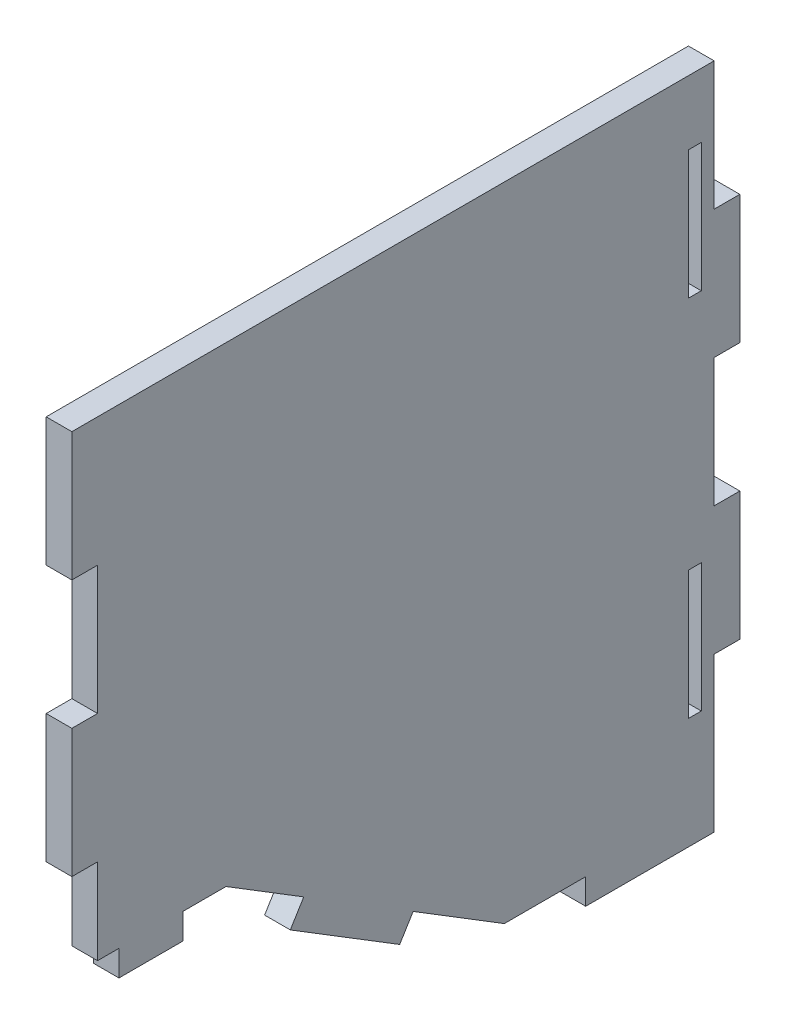
ISO-10303-21;
HEADER;
FILE_DESCRIPTION(('STEP AP214'),'2;1');
FILE_NAME('part.step','',(''),(''),'','','');
FILE_SCHEMA(('AUTOMOTIVE_DESIGN { 1 0 10303 214 1 1 1 1 }'));
ENDSEC;
DATA;
#1=APPLICATION_CONTEXT('core data for automotive mechanical design processes');
#2=APPLICATION_PROTOCOL_DEFINITION('international standard','automotive_design',2000,#1);
#3=PRODUCT_CONTEXT('',#1,'mechanical');
#4=PRODUCT('Part','Part','',(#3));
#5=PRODUCT_RELATED_PRODUCT_CATEGORY('part','',(#4));
#6=PRODUCT_DEFINITION_FORMATION('','',#4);
#7=PRODUCT_DEFINITION_CONTEXT('part definition',#1,'design');
#8=PRODUCT_DEFINITION('design','',#6,#7);
#9=PRODUCT_DEFINITION_SHAPE('','',#8);
#10=(LENGTH_UNIT() NAMED_UNIT(*) SI_UNIT(.MILLI.,.METRE.));
#11=(NAMED_UNIT(*) PLANE_ANGLE_UNIT() SI_UNIT($,.RADIAN.));
#12=(NAMED_UNIT(*) SI_UNIT($,.STERADIAN.) SOLID_ANGLE_UNIT());
#13=UNCERTAINTY_MEASURE_WITH_UNIT(LENGTH_MEASURE(1.E-05),#10,'distance_accuracy_value','');
#14=(GEOMETRIC_REPRESENTATION_CONTEXT(3) GLOBAL_UNCERTAINTY_ASSIGNED_CONTEXT((#13)) GLOBAL_UNIT_ASSIGNED_CONTEXT((#10,
#11,#12)) REPRESENTATION_CONTEXT('',''));
#15=CARTESIAN_POINT('',(0.,0.,0.));
#16=DIRECTION('',(0.,0.,1.));
#17=DIRECTION('',(1.,0.,0.));
#18=AXIS2_PLACEMENT_3D('',#15,#16,#17);
#19=CARTESIAN_POINT('',(-50.001,40.,75.));
#20=DIRECTION('',(0.,1.,0.));
#21=DIRECTION('',(0.,0.,1.));
#22=AXIS2_PLACEMENT_3D('',#19,#20,#21);
#23=PLANE('',#22);
#24=DIRECTION('',(-1.,0.,0.));
#25=VECTOR('',#24,1.);
#26=CARTESIAN_POINT('',(51.,40.,70.));
#27=LINE('',#26,#25);
#28=CARTESIAN_POINT('',(51.,40.,70.));
#29=VERTEX_POINT('',#28);
#30=CARTESIAN_POINT('',(45.,40.,70.));
#31=VERTEX_POINT('',#30);
#32=EDGE_CURVE('E651',#29,#31,#27,.T.);
#33=ORIENTED_EDGE('',*,*,#32,.F.);
#34=DIRECTION('',(0.,0.,-1.));
#35=VECTOR('',#34,1.);
#36=CARTESIAN_POINT('',(51.,40.,45.));
#37=LINE('',#36,#35);
#38=CARTESIAN_POINT('',(51.,40.,75.));
#39=VERTEX_POINT('',#38);
#40=EDGE_CURVE('E306',#39,#29,#37,.T.);
#41=ORIENTED_EDGE('',*,*,#40,.F.);
#42=DIRECTION('',(1.,0.,0.));
#43=VECTOR('',#42,1.);
#44=CARTESIAN_POINT('',(-50.001,40.,75.));
#45=LINE('',#44,#43);
#46=CARTESIAN_POINT('',(45.,40.,75.));
#47=VERTEX_POINT('',#46);
#48=EDGE_CURVE('E11',#47,#39,#45,.T.);
#49=ORIENTED_EDGE('',*,*,#48,.F.);
#50=DIRECTION('',(0.,0.,-1.));
#51=VECTOR('',#50,1.);
#52=CARTESIAN_POINT('',(45.,40.,75.));
#53=LINE('',#52,#51);
#54=EDGE_CURVE('E465',#47,#31,#53,.T.);
#55=ORIENTED_EDGE('',*,*,#54,.T.);
#56=EDGE_LOOP('',(#33,#41,#49,#55));
#57=FACE_BOUND('',#56,.T.);
#58=ADVANCED_FACE('F37',(#57),#23,.F.);
#59=DIRECTION('',(1.,0.,0.));
#60=VECTOR('',#59,1.);
#61=CARTESIAN_POINT('',(51.,40.,55.));
#62=LINE('',#61,#60);
#63=CARTESIAN_POINT('',(45.,40.,55.));
#64=VERTEX_POINT('',#63);
#65=CARTESIAN_POINT('',(51.,40.,55.));
#66=VERTEX_POINT('',#65);
#67=EDGE_CURVE('E300',#64,#66,#62,.T.);
#68=ORIENTED_EDGE('',*,*,#67,.F.);
#69=CARTESIAN_POINT('',(45.,40.,45.));
#70=VERTEX_POINT('',#69);
#71=EDGE_CURVE('E463',#64,#70,#53,.T.);
#72=ORIENTED_EDGE('',*,*,#71,.T.);
#73=DIRECTION('',(1.,0.,0.));
#74=VECTOR('',#73,1.);
#75=CARTESIAN_POINT('',(-50.001,40.,45.));
#76=LINE('',#75,#74);
#77=CARTESIAN_POINT('',(51.,40.,45.));
#78=VERTEX_POINT('',#77);
#79=EDGE_CURVE('E46',#70,#78,#76,.T.);
#80=ORIENTED_EDGE('',*,*,#79,.T.);
#81=EDGE_CURVE('E534',#66,#78,#37,.T.);
#82=ORIENTED_EDGE('',*,*,#81,.F.);
#83=EDGE_LOOP('',(#68,#72,#80,#82));
#84=FACE_BOUND('',#83,.T.);
#85=ADVANCED_FACE('F662',(#84),#23,.F.);
#86=CARTESIAN_POINT('',(-50.001,40.,45.));
#87=DIRECTION('',(0.,0.851658316704544,-0.524097425664335));
#88=DIRECTION('',(0.,0.524097425664335,0.851658316704544));
#89=AXIS2_PLACEMENT_3D('',#86,#87,#88);
#90=PLANE('',#89);
#91=DIRECTION('',(1.,0.,0.));
#92=VECTOR('',#91,1.);
#93=CARTESIAN_POINT('',(45.,13.1024356416084,1.29145791761358));
#94=LINE('',#93,#92);
#95=CARTESIAN_POINT('',(45.,13.1024356416084,1.29145791761358));
#96=VERTEX_POINT('',#95);
#97=CARTESIAN_POINT('',(51.,13.1024356416084,1.29145791761359));
#98=VERTEX_POINT('',#97);
#99=EDGE_CURVE('E307',#96,#98,#94,.T.);
#100=ORIENTED_EDGE('',*,*,#99,.F.);
#101=DIRECTION('',(0.,-0.524097425664335,-0.851658316704544));
#102=VECTOR('',#101,1.);
#103=CARTESIAN_POINT('',(45.,40.,45.));
#104=LINE('',#103,#102);
#105=CARTESIAN_POINT('',(45.,0.,-20.));
#106=VERTEX_POINT('',#105);
#107=EDGE_CURVE('E464',#96,#106,#104,.T.);
#108=ORIENTED_EDGE('',*,*,#107,.T.);
#109=DIRECTION('',(1.,0.,0.));
#110=VECTOR('',#109,1.);
#111=CARTESIAN_POINT('',(-50.001,0.,-20.));
#112=LINE('',#111,#110);
#113=CARTESIAN_POINT('',(51.,0.,-20.));
#114=VERTEX_POINT('',#113);
#115=EDGE_CURVE('E41',#106,#114,#112,.T.);
#116=ORIENTED_EDGE('',*,*,#115,.T.);
#117=DIRECTION('',(0.,-0.524097425664335,-0.851658316704544));
#118=VECTOR('',#117,1.);
#119=CARTESIAN_POINT('',(51.,0.,-20.));
#120=LINE('',#119,#118);
#121=EDGE_CURVE('E536',#98,#114,#120,.T.);
#122=ORIENTED_EDGE('',*,*,#121,.F.);
#123=EDGE_LOOP('',(#100,#108,#116,#122));
#124=FACE_BOUND('',#123,.T.);
#125=ADVANCED_FACE('F561',(#124),#90,.F.);
#126=DIRECTION('',(-1.,0.,0.));
#127=VECTOR('',#126,1.);
#128=CARTESIAN_POINT('',(45.,28.8253584115384,26.8412074187499));
#129=LINE('',#128,#127);
#130=CARTESIAN_POINT('',(51.,28.8253584115384,26.8412074187499));
#131=VERTEX_POINT('',#130);
#132=CARTESIAN_POINT('',(45.,28.8253584115384,26.8412074187499));
#133=VERTEX_POINT('',#132);
#134=EDGE_CURVE('E309',#131,#133,#129,.T.);
#135=ORIENTED_EDGE('',*,*,#134,.F.);
#136=EDGE_CURVE('E537',#78,#131,#120,.T.);
#137=ORIENTED_EDGE('',*,*,#136,.F.);
#138=ORIENTED_EDGE('',*,*,#79,.F.);
#139=EDGE_CURVE('E460',#70,#133,#104,.T.);
#140=ORIENTED_EDGE('',*,*,#139,.T.);
#141=EDGE_LOOP('',(#135,#137,#138,#140));
#142=FACE_BOUND('',#141,.T.);
#143=ADVANCED_FACE('F668',(#142),#90,.F.);
#144=CARTESIAN_POINT('',(-50.,150.,-75.));
#145=DIRECTION('',(0.,0.,1.));
#146=DIRECTION('',(1.,0.,0.));
#147=AXIS2_PLACEMENT_3D('',#144,#145,#146);
#148=PLANE('',#147);
#149=DIRECTION('',(0.,1.,0.));
#150=VECTOR('',#149,1.);
#151=CARTESIAN_POINT('',(45.,0.,-75.));
#152=LINE('',#151,#150);
#153=CARTESIAN_POINT('',(45.,30.,-75.));
#154=VERTEX_POINT('',#153);
#155=CARTESIAN_POINT('',(45.,60.,-75.));
#156=VERTEX_POINT('',#155);
#157=EDGE_CURVE('E459',#154,#156,#152,.T.);
#158=ORIENTED_EDGE('',*,*,#157,.T.);
#159=DIRECTION('',(1.,0.,0.));
#160=VECTOR('',#159,1.);
#161=CARTESIAN_POINT('',(45.,60.,-75.));
#162=LINE('',#161,#160);
#163=CARTESIAN_POINT('',(51.,60.,-75.));
#164=VERTEX_POINT('',#163);
#165=EDGE_CURVE('E373',#156,#164,#162,.T.);
#166=ORIENTED_EDGE('',*,*,#165,.T.);
#167=DIRECTION('',(0.,1.,0.));
#168=VECTOR('',#167,1.);
#169=CARTESIAN_POINT('',(51.,150.,-75.));
#170=LINE('',#169,#168);
#171=CARTESIAN_POINT('',(51.,30.,-75.));
#172=VERTEX_POINT('',#171);
#173=EDGE_CURVE('E545',#172,#164,#170,.T.);
#174=ORIENTED_EDGE('',*,*,#173,.F.);
#175=DIRECTION('',(1.,0.,0.));
#176=VECTOR('',#175,1.);
#177=CARTESIAN_POINT('',(45.,30.,-75.));
#178=LINE('',#177,#176);
#179=EDGE_CURVE('E388',#154,#172,#178,.T.);
#180=ORIENTED_EDGE('',*,*,#179,.F.);
#181=EDGE_LOOP('',(#158,#166,#174,#180));
#182=FACE_BOUND('',#181,.T.);
#183=ADVANCED_FACE('F587',(#182),#148,.F.);
#184=CARTESIAN_POINT('',(-50.,150.,75.));
#185=DIRECTION('',(0.,0.,-1.));
#186=DIRECTION('',(-1.,0.,0.));
#187=AXIS2_PLACEMENT_3D('',#184,#185,#186);
#188=PLANE('',#187);
#189=DIRECTION('',(1.,0.,0.));
#190=VECTOR('',#189,1.);
#191=CARTESIAN_POINT('',(45.,60.,75.));
#192=LINE('',#191,#190);
#193=CARTESIAN_POINT('',(45.,60.,75.));
#194=VERTEX_POINT('',#193);
#195=CARTESIAN_POINT('',(51.,60.,75.));
#196=VERTEX_POINT('',#195);
#197=EDGE_CURVE('E409',#194,#196,#192,.T.);
#198=ORIENTED_EDGE('',*,*,#197,.F.);
#199=DIRECTION('',(0.,-1.,0.));
#200=VECTOR('',#199,1.);
#201=CARTESIAN_POINT('',(45.,150.,75.));
#202=LINE('',#201,#200);
#203=EDGE_CURVE('E468',#194,#47,#202,.T.);
#204=ORIENTED_EDGE('',*,*,#203,.T.);
#205=ORIENTED_EDGE('',*,*,#48,.T.);
#206=DIRECTION('',(0.,-1.,0.));
#207=VECTOR('',#206,1.);
#208=CARTESIAN_POINT('',(51.,40.,75.));
#209=LINE('',#208,#207);
#210=EDGE_CURVE('E530',#196,#39,#209,.T.);
#211=ORIENTED_EDGE('',*,*,#210,.F.);
#212=EDGE_LOOP('',(#198,#204,#205,#211));
#213=FACE_BOUND('',#212,.T.);
#214=ADVANCED_FACE('F647',(#213),#188,.F.);
#215=DIRECTION('',(-1.,0.,0.));
#216=VECTOR('',#215,1.);
#217=CARTESIAN_POINT('',(45.,90.,75.));
#218=LINE('',#217,#216);
#219=CARTESIAN_POINT('',(51.,90.,75.));
#220=VERTEX_POINT('',#219);
#221=CARTESIAN_POINT('',(45.,90.,75.));
#222=VERTEX_POINT('',#221);
#223=EDGE_CURVE('E417',#220,#222,#218,.T.);
#224=ORIENTED_EDGE('',*,*,#223,.F.);
#225=CARTESIAN_POINT('',(51.,120.,75.));
#226=VERTEX_POINT('',#225);
#227=EDGE_CURVE('E531',#226,#220,#209,.T.);
#228=ORIENTED_EDGE('',*,*,#227,.F.);
#229=DIRECTION('',(1.,0.,0.));
#230=VECTOR('',#229,1.);
#231=CARTESIAN_POINT('',(45.,120.,75.));
#232=LINE('',#231,#230);
#233=CARTESIAN_POINT('',(45.,120.,75.));
#234=VERTEX_POINT('',#233);
#235=EDGE_CURVE('E435',#234,#226,#232,.T.);
#236=ORIENTED_EDGE('',*,*,#235,.F.);
#237=EDGE_CURVE('E469',#234,#222,#202,.T.);
#238=ORIENTED_EDGE('',*,*,#237,.T.);
#239=EDGE_LOOP('',(#224,#228,#236,#238));
#240=FACE_BOUND('',#239,.T.);
#241=ADVANCED_FACE('F632',(#240),#188,.F.);
#242=CARTESIAN_POINT('',(51.,90.,-75.));
#243=VERTEX_POINT('',#242);
#244=CARTESIAN_POINT('',(51.,120.,-75.));
#245=VERTEX_POINT('',#244);
#246=EDGE_CURVE('E543',#243,#245,#170,.T.);
#247=ORIENTED_EDGE('',*,*,#246,.F.);
#248=DIRECTION('',(1.,0.,0.));
#249=VECTOR('',#248,1.);
#250=CARTESIAN_POINT('',(45.,90.,-75.));
#251=LINE('',#250,#249);
#252=CARTESIAN_POINT('',(45.,90.,-75.));
#253=VERTEX_POINT('',#252);
#254=EDGE_CURVE('E364',#253,#243,#251,.T.);
#255=ORIENTED_EDGE('',*,*,#254,.F.);
#256=CARTESIAN_POINT('',(45.,120.,-75.));
#257=VERTEX_POINT('',#256);
#258=EDGE_CURVE('E457',#253,#257,#152,.T.);
#259=ORIENTED_EDGE('',*,*,#258,.T.);
#260=DIRECTION('',(1.,0.,0.));
#261=VECTOR('',#260,1.);
#262=CARTESIAN_POINT('',(45.,120.,-75.));
#263=LINE('',#262,#261);
#264=EDGE_CURVE('E406',#257,#245,#263,.T.);
#265=ORIENTED_EDGE('',*,*,#264,.T.);
#266=EDGE_LOOP('',(#247,#255,#259,#265));
#267=FACE_BOUND('',#266,.T.);
#268=ADVANCED_FACE('F39',(#267),#148,.F.);
#269=CARTESIAN_POINT('',(45.,150.,75.));
#270=DIRECTION('',(-1.,0.,0.));
#271=DIRECTION('',(0.,0.,1.));
#272=AXIS2_PLACEMENT_3D('',#269,#270,#271);
#273=PLANE('',#272);
#274=DIRECTION('',(0.,0.,-1.));
#275=VECTOR('',#274,1.);
#276=CARTESIAN_POINT('',(45.,60.,-75.));
#277=LINE('',#276,#275);
#278=CARTESIAN_POINT('',(45.,60.,-69.));
#279=VERTEX_POINT('',#278);
#280=EDGE_CURVE('E361',#279,#156,#277,.T.);
#281=ORIENTED_EDGE('',*,*,#280,.T.);
#282=ORIENTED_EDGE('',*,*,#157,.F.);
#283=DIRECTION('',(0.,0.,1.));
#284=VECTOR('',#283,1.);
#285=CARTESIAN_POINT('',(45.,30.,-75.));
#286=LINE('',#285,#284);
#287=CARTESIAN_POINT('',(45.,30.,-69.));
#288=VERTEX_POINT('',#287);
#289=EDGE_CURVE('E382',#154,#288,#286,.T.);
#290=ORIENTED_EDGE('',*,*,#289,.T.);
#291=DIRECTION('',(0.,-1.,0.));
#292=VECTOR('',#291,1.);
#293=CARTESIAN_POINT('',(45.,30.,-69.));
#294=LINE('',#293,#292);
#295=CARTESIAN_POINT('',(45.,-6.,-69.));
#296=VERTEX_POINT('',#295);
#297=EDGE_CURVE('E385',#288,#296,#294,.T.);
#298=ORIENTED_EDGE('',*,*,#297,.T.);
#299=DIRECTION('',(0.,0.,-1.));
#300=VECTOR('',#299,1.);
#301=CARTESIAN_POINT('',(45.,-6.,-69.));
#302=LINE('',#301,#300);
#303=CARTESIAN_POINT('',(45.,-6.,-39.));
#304=VERTEX_POINT('',#303);
#305=EDGE_CURVE('E339',#304,#296,#302,.T.);
#306=ORIENTED_EDGE('',*,*,#305,.F.);
#307=DIRECTION('',(0.,1.,0.));
#308=VECTOR('',#307,1.);
#309=CARTESIAN_POINT('',(45.,-6.,-39.));
#310=LINE('',#309,#308);
#311=CARTESIAN_POINT('',(45.,0.,-39.));
#312=VERTEX_POINT('',#311);
#313=EDGE_CURVE('E345',#304,#312,#310,.T.);
#314=ORIENTED_EDGE('',*,*,#313,.T.);
#315=DIRECTION('',(0.,0.,-1.));
#316=VECTOR('',#315,1.);
#317=CARTESIAN_POINT('',(45.,0.,-75.));
#318=LINE('',#317,#316);
#319=EDGE_CURVE('E455',#106,#312,#318,.T.);
#320=ORIENTED_EDGE('',*,*,#319,.F.);
#321=ORIENTED_EDGE('',*,*,#107,.F.);
#322=DIRECTION('',(0.,0.851658316704544,-0.524097425664335));
#323=VECTOR('',#322,1.);
#324=CARTESIAN_POINT('',(45.,7.9924857413811,4.43604247159959));
#325=LINE('',#324,#323);
#326=CARTESIAN_POINT('',(45.,7.9924857413811,4.43604247159959));
#327=VERTEX_POINT('',#326);
#328=EDGE_CURVE('E331',#327,#96,#325,.T.);
#329=ORIENTED_EDGE('',*,*,#328,.F.);
#330=DIRECTION('',(0.,-0.524097425664335,-0.851658316704544));
#331=VECTOR('',#330,1.);
#332=CARTESIAN_POINT('',(45.,23.7154085113111,29.9857919727359));
#333=LINE('',#332,#331);
#334=CARTESIAN_POINT('',(45.,23.7154085113111,29.9857919727359));
#335=VERTEX_POINT('',#334);
#336=EDGE_CURVE('E315',#335,#327,#333,.T.);
#337=ORIENTED_EDGE('',*,*,#336,.F.);
#338=DIRECTION('',(0.,0.851658316704544,-0.524097425664335));
#339=VECTOR('',#338,1.);
#340=CARTESIAN_POINT('',(45.,23.7154085113111,29.9857919727359));
#341=LINE('',#340,#339);
#342=EDGE_CURVE('E323',#335,#133,#341,.T.);
#343=ORIENTED_EDGE('',*,*,#342,.T.);
#344=ORIENTED_EDGE('',*,*,#139,.F.);
#345=ORIENTED_EDGE('',*,*,#71,.F.);
#346=DIRECTION('',(0.,1.,0.));
#347=VECTOR('',#346,1.);
#348=CARTESIAN_POINT('',(45.,34.,55.));
#349=LINE('',#348,#347);
#350=CARTESIAN_POINT('',(45.,34.,55.));
#351=VERTEX_POINT('',#350);
#352=EDGE_CURVE('E311',#351,#64,#349,.T.);
#353=ORIENTED_EDGE('',*,*,#352,.F.);
#354=DIRECTION('',(0.,0.,-1.));
#355=VECTOR('',#354,1.);
#356=CARTESIAN_POINT('',(45.,34.,70.));
#357=LINE('',#356,#355);
#358=CARTESIAN_POINT('',(45.,34.,70.));
#359=VERTEX_POINT('',#358);
#360=EDGE_CURVE('E294',#359,#351,#357,.T.);
#361=ORIENTED_EDGE('',*,*,#360,.F.);
#362=DIRECTION('',(0.,1.,0.));
#363=VECTOR('',#362,1.);
#364=CARTESIAN_POINT('',(45.,34.,70.));
#365=LINE('',#364,#363);
#366=EDGE_CURVE('E291',#359,#31,#365,.T.);
#367=ORIENTED_EDGE('',*,*,#366,.T.);
#368=ORIENTED_EDGE('',*,*,#54,.F.);
#369=ORIENTED_EDGE('',*,*,#203,.F.);
#370=DIRECTION('',(0.,0.,-1.));
#371=VECTOR('',#370,1.);
#372=CARTESIAN_POINT('',(45.,60.,81.));
#373=LINE('',#372,#371);
#374=CARTESIAN_POINT('',(45.,60.,81.));
#375=VERTEX_POINT('',#374);
#376=EDGE_CURVE('E433',#375,#194,#373,.T.);
#377=ORIENTED_EDGE('',*,*,#376,.F.);
#378=DIRECTION('',(0.,-1.,0.));
#379=VECTOR('',#378,1.);
#380=CARTESIAN_POINT('',(45.,90.,81.));
#381=LINE('',#380,#379);
#382=CARTESIAN_POINT('',(45.,90.,81.));
#383=VERTEX_POINT('',#382);
#384=EDGE_CURVE('E413',#383,#375,#381,.T.);
#385=ORIENTED_EDGE('',*,*,#384,.F.);
#386=DIRECTION('',(0.,0.,-1.));
#387=VECTOR('',#386,1.);
#388=CARTESIAN_POINT('',(45.,90.,81.));
#389=LINE('',#388,#387);
#390=EDGE_CURVE('E423',#383,#222,#389,.T.);
#391=ORIENTED_EDGE('',*,*,#390,.T.);
#392=ORIENTED_EDGE('',*,*,#237,.F.);
#393=DIRECTION('',(0.,0.,-1.));
#394=VECTOR('',#393,1.);
#395=CARTESIAN_POINT('',(45.,120.,81.));
#396=LINE('',#395,#394);
#397=CARTESIAN_POINT('',(45.,120.,81.));
#398=VERTEX_POINT('',#397);
#399=EDGE_CURVE('E452',#398,#234,#396,.T.);
#400=ORIENTED_EDGE('',*,*,#399,.F.);
#401=DIRECTION('',(0.,-1.,0.));
#402=VECTOR('',#401,1.);
#403=CARTESIAN_POINT('',(45.,150.,81.));
#404=LINE('',#403,#402);
#405=CARTESIAN_POINT('',(45.,150.,81.));
#406=VERTEX_POINT('',#405);
#407=EDGE_CURVE('E436',#406,#398,#404,.T.);
#408=ORIENTED_EDGE('',*,*,#407,.F.);
#409=DIRECTION('',(0.,0.,-1.));
#410=VECTOR('',#409,1.);
#411=CARTESIAN_POINT('',(45.,150.,0.));
#412=LINE('',#411,#410);
#413=CARTESIAN_POINT('',(45.,150.,-69.));
#414=VERTEX_POINT('',#413);
#415=EDGE_CURVE('E548',#406,#414,#412,.T.);
#416=ORIENTED_EDGE('',*,*,#415,.T.);
#417=DIRECTION('',(0.,-1.,0.));
#418=VECTOR('',#417,1.);
#419=CARTESIAN_POINT('',(45.,150.,-69.));
#420=LINE('',#419,#418);
#421=CARTESIAN_POINT('',(45.,120.,-69.));
#422=VERTEX_POINT('',#421);
#423=EDGE_CURVE('E394',#414,#422,#420,.T.);
#424=ORIENTED_EDGE('',*,*,#423,.T.);
#425=DIRECTION('',(0.,0.,-1.));
#426=VECTOR('',#425,1.);
#427=CARTESIAN_POINT('',(45.,120.,-75.));
#428=LINE('',#427,#426);
#429=EDGE_CURVE('E397',#422,#257,#428,.T.);
#430=ORIENTED_EDGE('',*,*,#429,.T.);
#431=ORIENTED_EDGE('',*,*,#258,.F.);
#432=DIRECTION('',(0.,0.,1.));
#433=VECTOR('',#432,1.);
#434=CARTESIAN_POINT('',(45.,90.,-75.));
#435=LINE('',#434,#433);
#436=CARTESIAN_POINT('',(45.,90.,-69.));
#437=VERTEX_POINT('',#436);
#438=EDGE_CURVE('E354',#253,#437,#435,.T.);
#439=ORIENTED_EDGE('',*,*,#438,.T.);
#440=DIRECTION('',(0.,-1.,0.));
#441=VECTOR('',#440,1.);
#442=CARTESIAN_POINT('',(45.,90.,-69.));
#443=LINE('',#442,#441);
#444=EDGE_CURVE('E357',#437,#279,#443,.T.);
#445=ORIENTED_EDGE('',*,*,#444,.T.);
#446=EDGE_LOOP('',(#281,#282,#290,#298,#306,#314,#320,#321,#329,#337,#343,#344,#345,#353,#361,
#367,#368,#369,#377,#385,#391,#392,#400,#408,#416,#424,#430,#431,#439,#445));
#447=FACE_BOUND('',#446,.T.);
#448=DIRECTION('',(0.,-1.,0.));
#449=VECTOR('',#448,1.);
#450=CARTESIAN_POINT('',(45.,150.,-66.));
#451=LINE('',#450,#449);
#452=CARTESIAN_POINT('',(45.,135.,-66.));
#453=VERTEX_POINT('',#452);
#454=CARTESIAN_POINT('',(45.,105.,-66.));
#455=VERTEX_POINT('',#454);
#456=EDGE_CURVE('E528',#453,#455,#451,.T.);
#457=ORIENTED_EDGE('',*,*,#456,.F.);
#458=DIRECTION('',(0.,0.,-1.));
#459=VECTOR('',#458,1.);
#460=CARTESIAN_POINT('',(45.,135.,75.));
#461=LINE('',#460,#459);
#462=CARTESIAN_POINT('',(45.,135.,-63.));
#463=VERTEX_POINT('',#462);
#464=EDGE_CURVE('E521',#463,#453,#461,.T.);
#465=ORIENTED_EDGE('',*,*,#464,.F.);
#466=DIRECTION('',(0.,1.,0.));
#467=VECTOR('',#466,1.);
#468=CARTESIAN_POINT('',(45.,150.,-63.));
#469=LINE('',#468,#467);
#470=CARTESIAN_POINT('',(45.,105.,-63.));
#471=VERTEX_POINT('',#470);
#472=EDGE_CURVE('E523',#471,#463,#469,.T.);
#473=ORIENTED_EDGE('',*,*,#472,.F.);
#474=DIRECTION('',(0.,0.,1.));
#475=VECTOR('',#474,1.);
#476=CARTESIAN_POINT('',(45.,105.,75.));
#477=LINE('',#476,#475);
#478=EDGE_CURVE('E526',#455,#471,#477,.T.);
#479=ORIENTED_EDGE('',*,*,#478,.F.);
#480=EDGE_LOOP('',(#457,#465,#473,#479));
#481=FACE_BOUND('',#480,.T.);
#482=DIRECTION('',(0.,-1.,0.));
#483=VECTOR('',#482,1.);
#484=CARTESIAN_POINT('',(45.,150.,-66.));
#485=LINE('',#484,#483);
#486=CARTESIAN_POINT('',(45.,50.,-66.));
#487=VERTEX_POINT('',#486);
#488=CARTESIAN_POINT('',(45.,20.,-66.));
#489=VERTEX_POINT('',#488);
#490=EDGE_CURVE('E519',#487,#489,#485,.T.);
#491=ORIENTED_EDGE('',*,*,#490,.F.);
#492=DIRECTION('',(0.,0.,-1.));
#493=VECTOR('',#492,1.);
#494=CARTESIAN_POINT('',(45.,50.0000000000003,75.0000000000002));
#495=LINE('',#494,#493);
#496=CARTESIAN_POINT('',(45.,50.,-63.));
#497=VERTEX_POINT('',#496);
#498=EDGE_CURVE('E488',#497,#487,#495,.T.);
#499=ORIENTED_EDGE('',*,*,#498,.F.);
#500=DIRECTION('',(0.,1.,0.));
#501=VECTOR('',#500,1.);
#502=CARTESIAN_POINT('',(45.,150.,-63.));
#503=LINE('',#502,#501);
#504=CARTESIAN_POINT('',(45.,20.,-63.));
#505=VERTEX_POINT('',#504);
#506=EDGE_CURVE('E514',#505,#497,#503,.T.);
#507=ORIENTED_EDGE('',*,*,#506,.F.);
#508=DIRECTION('',(0.,0.,1.));
#509=VECTOR('',#508,1.);
#510=CARTESIAN_POINT('',(45.,20.,75.));
#511=LINE('',#510,#509);
#512=EDGE_CURVE('E517',#489,#505,#511,.T.);
#513=ORIENTED_EDGE('',*,*,#512,.F.);
#514=EDGE_LOOP('',(#491,#499,#507,#513));
#515=FACE_BOUND('',#514,.T.);
#516=ADVANCED_FACE('F589',(#447,#481,#515),#273,.T.);
#517=CARTESIAN_POINT('',(0.,150.,0.));
#518=DIRECTION('',(0.,-1.,0.));
#519=DIRECTION('',(0.,0.,-1.));
#520=AXIS2_PLACEMENT_3D('',#517,#518,#519);
#521=PLANE('',#520);
#522=DIRECTION('',(0.,0.,1.));
#523=VECTOR('',#522,1.);
#524=CARTESIAN_POINT('',(51.,150.,75.));
#525=LINE('',#524,#523);
#526=CARTESIAN_POINT('',(51.,150.,-69.));
#527=VERTEX_POINT('',#526);
#528=CARTESIAN_POINT('',(51.,150.,81.));
#529=VERTEX_POINT('',#528);
#530=EDGE_CURVE('E546',#527,#529,#525,.T.);
#531=ORIENTED_EDGE('',*,*,#530,.F.);
#532=DIRECTION('',(1.,0.,0.));
#533=VECTOR('',#532,1.);
#534=CARTESIAN_POINT('',(45.,150.,-69.));
#535=LINE('',#534,#533);
#536=EDGE_CURVE('E401',#414,#527,#535,.T.);
#537=ORIENTED_EDGE('',*,*,#536,.F.);
#538=ORIENTED_EDGE('',*,*,#415,.F.);
#539=DIRECTION('',(-1.,0.,0.));
#540=VECTOR('',#539,1.);
#541=CARTESIAN_POINT('',(45.,150.,81.));
#542=LINE('',#541,#540);
#543=EDGE_CURVE('E444',#529,#406,#542,.T.);
#544=ORIENTED_EDGE('',*,*,#543,.F.);
#545=EDGE_LOOP('',(#531,#537,#538,#544));
#546=FACE_BOUND('',#545,.T.);
#547=ADVANCED_FACE('F618',(#546),#521,.F.);
#548=CARTESIAN_POINT('',(0.,0.,0.));
#549=DIRECTION('',(0.,-1.,0.));
#550=DIRECTION('',(0.,0.,-1.));
#551=AXIS2_PLACEMENT_3D('',#548,#549,#550);
#552=PLANE('',#551);
#553=DIRECTION('',(-1.,0.,0.));
#554=VECTOR('',#553,1.);
#555=CARTESIAN_POINT('',(51.,0.,-39.));
#556=LINE('',#555,#554);
#557=CARTESIAN_POINT('',(51.,0.,-39.));
#558=VERTEX_POINT('',#557);
#559=EDGE_CURVE('E333',#558,#312,#556,.T.);
#560=ORIENTED_EDGE('',*,*,#559,.F.);
#561=DIRECTION('',(0.,0.,-1.));
#562=VECTOR('',#561,1.);
#563=CARTESIAN_POINT('',(51.,0.,-75.));
#564=LINE('',#563,#562);
#565=EDGE_CURVE('E540',#114,#558,#564,.T.);
#566=ORIENTED_EDGE('',*,*,#565,.F.);
#567=ORIENTED_EDGE('',*,*,#115,.F.);
#568=ORIENTED_EDGE('',*,*,#319,.T.);
#569=EDGE_LOOP('',(#560,#566,#567,#568));
#570=FACE_BOUND('',#569,.T.);
#571=ADVANCED_FACE('F565',(#570),#552,.T.);
#572=CARTESIAN_POINT('',(51.,0.,0.));
#573=DIRECTION('',(-1.,0.,0.));
#574=DIRECTION('',(0.,0.,1.));
#575=AXIS2_PLACEMENT_3D('',#572,#573,#574);
#576=PLANE('',#575);
#577=DIRECTION('',(0.,0.,1.));
#578=VECTOR('',#577,1.);
#579=CARTESIAN_POINT('',(51.,135.,-66.));
#580=LINE('',#579,#578);
#581=CARTESIAN_POINT('',(51.,135.,-66.));
#582=VERTEX_POINT('',#581);
#583=CARTESIAN_POINT('',(51.,135.,-63.));
#584=VERTEX_POINT('',#583);
#585=EDGE_CURVE('E475',#582,#584,#580,.T.);
#586=ORIENTED_EDGE('',*,*,#585,.F.);
#587=DIRECTION('',(0.,1.,0.));
#588=VECTOR('',#587,1.);
#589=CARTESIAN_POINT('',(51.,135.,-66.));
#590=LINE('',#589,#588);
#591=CARTESIAN_POINT('',(51.,105.,-66.));
#592=VERTEX_POINT('',#591);
#593=EDGE_CURVE('E473',#592,#582,#590,.T.);
#594=ORIENTED_EDGE('',*,*,#593,.F.);
#595=DIRECTION('',(0.,0.,-1.));
#596=VECTOR('',#595,1.);
#597=CARTESIAN_POINT('',(51.,105.,-66.));
#598=LINE('',#597,#596);
#599=CARTESIAN_POINT('',(51.,105.,-63.));
#600=VERTEX_POINT('',#599);
#601=EDGE_CURVE('E482',#600,#592,#598,.T.);
#602=ORIENTED_EDGE('',*,*,#601,.F.);
#603=DIRECTION('',(0.,-1.,0.));
#604=VECTOR('',#603,1.);
#605=CARTESIAN_POINT('',(51.,135.,-63.));
#606=LINE('',#605,#604);
#607=EDGE_CURVE('E479',#584,#600,#606,.T.);
#608=ORIENTED_EDGE('',*,*,#607,.F.);
#609=EDGE_LOOP('',(#586,#594,#602,#608));
#610=FACE_BOUND('',#609,.T.);
#611=DIRECTION('',(0.,0.,1.));
#612=VECTOR('',#611,1.);
#613=CARTESIAN_POINT('',(51.,50.,-66.));
#614=LINE('',#613,#612);
#615=CARTESIAN_POINT('',(51.,50.,-66.));
#616=VERTEX_POINT('',#615);
#617=CARTESIAN_POINT('',(51.,50.,-63.));
#618=VERTEX_POINT('',#617);
#619=EDGE_CURVE('E496',#616,#618,#614,.T.);
#620=ORIENTED_EDGE('',*,*,#619,.F.);
#621=DIRECTION('',(0.,1.,0.));
#622=VECTOR('',#621,1.);
#623=CARTESIAN_POINT('',(51.,20.,-66.));
#624=LINE('',#623,#622);
#625=CARTESIAN_POINT('',(51.,20.,-66.));
#626=VERTEX_POINT('',#625);
#627=EDGE_CURVE('E472',#626,#616,#624,.T.);
#628=ORIENTED_EDGE('',*,*,#627,.F.);
#629=DIRECTION('',(0.,0.,-1.));
#630=VECTOR('',#629,1.);
#631=CARTESIAN_POINT('',(51.,20.,-66.));
#632=LINE('',#631,#630);
#633=CARTESIAN_POINT('',(51.,20.,-63.));
#634=VERTEX_POINT('',#633);
#635=EDGE_CURVE('E502',#634,#626,#632,.T.);
#636=ORIENTED_EDGE('',*,*,#635,.F.);
#637=DIRECTION('',(0.,-1.,0.));
#638=VECTOR('',#637,1.);
#639=CARTESIAN_POINT('',(51.,20.,-63.));
#640=LINE('',#639,#638);
#641=EDGE_CURVE('E499',#618,#634,#640,.T.);
#642=ORIENTED_EDGE('',*,*,#641,.F.);
#643=EDGE_LOOP('',(#620,#628,#636,#642));
#644=FACE_BOUND('',#643,.T.);
#645=ORIENTED_EDGE('',*,*,#173,.T.);
#646=DIRECTION('',(0.,0.,-1.));
#647=VECTOR('',#646,1.);
#648=CARTESIAN_POINT('',(51.,60.,-75.));
#649=LINE('',#648,#647);
#650=CARTESIAN_POINT('',(51.,60.,-69.));
#651=VERTEX_POINT('',#650);
#652=EDGE_CURVE('E358',#651,#164,#649,.T.);
#653=ORIENTED_EDGE('',*,*,#652,.F.);
#654=DIRECTION('',(0.,-1.,0.));
#655=VECTOR('',#654,1.);
#656=CARTESIAN_POINT('',(51.,90.,-69.));
#657=LINE('',#656,#655);
#658=CARTESIAN_POINT('',(51.,90.,-69.));
#659=VERTEX_POINT('',#658);
#660=EDGE_CURVE('E368',#659,#651,#657,.T.);
#661=ORIENTED_EDGE('',*,*,#660,.F.);
#662=DIRECTION('',(0.,0.,1.));
#663=VECTOR('',#662,1.);
#664=CARTESIAN_POINT('',(51.,90.,-75.));
#665=LINE('',#664,#663);
#666=EDGE_CURVE('E365',#243,#659,#665,.T.);
#667=ORIENTED_EDGE('',*,*,#666,.F.);
#668=ORIENTED_EDGE('',*,*,#246,.T.);
#669=DIRECTION('',(0.,0.,-1.));
#670=VECTOR('',#669,1.);
#671=CARTESIAN_POINT('',(51.,120.,-75.));
#672=LINE('',#671,#670);
#673=CARTESIAN_POINT('',(51.,120.,-69.));
#674=VERTEX_POINT('',#673);
#675=EDGE_CURVE('E398',#674,#245,#672,.T.);
#676=ORIENTED_EDGE('',*,*,#675,.F.);
#677=DIRECTION('',(0.,-1.,0.));
#678=VECTOR('',#677,1.);
#679=CARTESIAN_POINT('',(51.,150.,-69.));
#680=LINE('',#679,#678);
#681=EDGE_CURVE('E376',#527,#674,#680,.T.);
#682=ORIENTED_EDGE('',*,*,#681,.F.);
#683=ORIENTED_EDGE('',*,*,#530,.T.);
#684=DIRECTION('',(0.,1.,0.));
#685=VECTOR('',#684,1.);
#686=CARTESIAN_POINT('',(51.,150.,81.));
#687=LINE('',#686,#685);
#688=CARTESIAN_POINT('',(51.,120.,81.));
#689=VERTEX_POINT('',#688);
#690=EDGE_CURVE('E441',#689,#529,#687,.T.);
#691=ORIENTED_EDGE('',*,*,#690,.F.);
#692=DIRECTION('',(0.,0.,-1.));
#693=VECTOR('',#692,1.);
#694=CARTESIAN_POINT('',(51.,120.,81.));
#695=LINE('',#694,#693);
#696=EDGE_CURVE('E447',#689,#226,#695,.T.);
#697=ORIENTED_EDGE('',*,*,#696,.T.);
#698=ORIENTED_EDGE('',*,*,#227,.T.);
#699=DIRECTION('',(0.,0.,-1.));
#700=VECTOR('',#699,1.);
#701=CARTESIAN_POINT('',(51.,90.,81.));
#702=LINE('',#701,#700);
#703=CARTESIAN_POINT('',(51.,90.,81.));
#704=VERTEX_POINT('',#703);
#705=EDGE_CURVE('E429',#704,#220,#702,.T.);
#706=ORIENTED_EDGE('',*,*,#705,.F.);
#707=DIRECTION('',(0.,1.,0.));
#708=VECTOR('',#707,1.);
#709=CARTESIAN_POINT('',(51.,90.,81.));
#710=LINE('',#709,#708);
#711=CARTESIAN_POINT('',(51.,60.,81.));
#712=VERTEX_POINT('',#711);
#713=EDGE_CURVE('E419',#712,#704,#710,.T.);
#714=ORIENTED_EDGE('',*,*,#713,.F.);
#715=DIRECTION('',(0.,0.,-1.));
#716=VECTOR('',#715,1.);
#717=CARTESIAN_POINT('',(51.,60.,81.));
#718=LINE('',#717,#716);
#719=EDGE_CURVE('E431',#712,#196,#718,.T.);
#720=ORIENTED_EDGE('',*,*,#719,.T.);
#721=ORIENTED_EDGE('',*,*,#210,.T.);
#722=ORIENTED_EDGE('',*,*,#40,.T.);
#723=DIRECTION('',(0.,1.,0.));
#724=VECTOR('',#723,1.);
#725=CARTESIAN_POINT('',(51.,34.,70.));
#726=LINE('',#725,#724);
#727=CARTESIAN_POINT('',(51.,34.,70.));
#728=VERTEX_POINT('',#727);
#729=EDGE_CURVE('E288',#728,#29,#726,.T.);
#730=ORIENTED_EDGE('',*,*,#729,.F.);
#731=DIRECTION('',(0.,0.,1.));
#732=VECTOR('',#731,1.);
#733=CARTESIAN_POINT('',(51.,34.,70.));
#734=LINE('',#733,#732);
#735=CARTESIAN_POINT('',(51.,34.,55.));
#736=VERTEX_POINT('',#735);
#737=EDGE_CURVE('E295',#736,#728,#734,.T.);
#738=ORIENTED_EDGE('',*,*,#737,.F.);
#739=DIRECTION('',(0.,1.,0.));
#740=VECTOR('',#739,1.);
#741=CARTESIAN_POINT('',(51.,34.,55.));
#742=LINE('',#741,#740);
#743=EDGE_CURVE('E54',#736,#66,#742,.T.);
#744=ORIENTED_EDGE('',*,*,#743,.T.);
#745=ORIENTED_EDGE('',*,*,#81,.T.);
#746=ORIENTED_EDGE('',*,*,#136,.T.);
#747=DIRECTION('',(0.,0.851658316704544,-0.524097425664335));
#748=VECTOR('',#747,1.);
#749=CARTESIAN_POINT('',(51.,23.7154085113111,29.9857919727359));
#750=LINE('',#749,#748);
#751=CARTESIAN_POINT('',(51.,23.7154085113111,29.9857919727359));
#752=VERTEX_POINT('',#751);
#753=EDGE_CURVE('E328',#752,#131,#750,.T.);
#754=ORIENTED_EDGE('',*,*,#753,.F.);
#755=DIRECTION('',(0.,0.524097425664335,0.851658316704544));
#756=VECTOR('',#755,1.);
#757=CARTESIAN_POINT('',(51.,23.7154085113111,29.9857919727359));
#758=LINE('',#757,#756);
#759=CARTESIAN_POINT('',(51.,7.9924857413811,4.4360424715996));
#760=VERTEX_POINT('',#759);
#761=EDGE_CURVE('E320',#760,#752,#758,.T.);
#762=ORIENTED_EDGE('',*,*,#761,.F.);
#763=DIRECTION('',(0.,0.851658316704544,-0.524097425664335));
#764=VECTOR('',#763,1.);
#765=CARTESIAN_POINT('',(51.,7.9924857413811,4.4360424715996));
#766=LINE('',#765,#764);
#767=EDGE_CURVE('E61',#760,#98,#766,.T.);
#768=ORIENTED_EDGE('',*,*,#767,.T.);
#769=ORIENTED_EDGE('',*,*,#121,.T.);
#770=ORIENTED_EDGE('',*,*,#565,.T.);
#771=DIRECTION('',(0.,1.,0.));
#772=VECTOR('',#771,1.);
#773=CARTESIAN_POINT('',(51.,-6.,-39.));
#774=LINE('',#773,#772);
#775=CARTESIAN_POINT('',(51.,-6.,-39.));
#776=VERTEX_POINT('',#775);
#777=EDGE_CURVE('E350',#776,#558,#774,.T.);
#778=ORIENTED_EDGE('',*,*,#777,.F.);
#779=DIRECTION('',(0.,0.,1.));
#780=VECTOR('',#779,1.);
#781=CARTESIAN_POINT('',(51.,-6.,-69.));
#782=LINE('',#781,#780);
#783=CARTESIAN_POINT('',(51.,-6.,-69.));
#784=VERTEX_POINT('',#783);
#785=EDGE_CURVE('E334',#784,#776,#782,.T.);
#786=ORIENTED_EDGE('',*,*,#785,.F.);
#787=DIRECTION('',(0.,-1.,0.));
#788=VECTOR('',#787,1.);
#789=CARTESIAN_POINT('',(51.,30.,-69.));
#790=LINE('',#789,#788);
#791=CARTESIAN_POINT('',(51.,30.,-69.));
#792=VERTEX_POINT('',#791);
#793=EDGE_CURVE('E386',#792,#784,#790,.T.);
#794=ORIENTED_EDGE('',*,*,#793,.F.);
#795=DIRECTION('',(0.,0.,1.));
#796=VECTOR('',#795,1.);
#797=CARTESIAN_POINT('',(51.,30.,-75.));
#798=LINE('',#797,#796);
#799=EDGE_CURVE('E353',#172,#792,#798,.T.);
#800=ORIENTED_EDGE('',*,*,#799,.F.);
#801=EDGE_LOOP('',(#645,#653,#661,#667,#668,#676,#682,#683,#691,#697,#698,#706,#714,#720,#721,
#722,#730,#738,#744,#745,#746,#754,#762,#768,#769,#770,#778,#786,#794,#800));
#802=FACE_BOUND('',#801,.T.);
#803=ADVANCED_FACE('F304',(#610,#644,#802),#576,.F.);
#804=CARTESIAN_POINT('',(-50.,50.,-66.));
#805=DIRECTION('',(0.,1.,0.));
#806=DIRECTION('',(0.,0.,1.));
#807=AXIS2_PLACEMENT_3D('',#804,#805,#806);
#808=PLANE('',#807);
#809=ORIENTED_EDGE('',*,*,#498,.T.);
#810=DIRECTION('',(1.,0.,0.));
#811=VECTOR('',#810,1.);
#812=CARTESIAN_POINT('',(-50.,50.,-66.));
#813=LINE('',#812,#811);
#814=EDGE_CURVE('E505',#487,#616,#813,.T.);
#815=ORIENTED_EDGE('',*,*,#814,.T.);
#816=ORIENTED_EDGE('',*,*,#619,.T.);
#817=DIRECTION('',(1.,0.,0.));
#818=VECTOR('',#817,1.);
#819=CARTESIAN_POINT('',(-50.,50.,-63.));
#820=LINE('',#819,#818);
#821=EDGE_CURVE('E509',#497,#618,#820,.T.);
#822=ORIENTED_EDGE('',*,*,#821,.F.);
#823=EDGE_LOOP('',(#809,#815,#816,#822));
#824=FACE_BOUND('',#823,.T.);
#825=ADVANCED_FACE('F732',(#824),#808,.F.);
#826=CARTESIAN_POINT('',(-50.,20.,-63.));
#827=DIRECTION('',(0.,0.,1.));
#828=DIRECTION('',(0.,-1.,0.));
#829=AXIS2_PLACEMENT_3D('',#826,#827,#828);
#830=PLANE('',#829);
#831=ORIENTED_EDGE('',*,*,#506,.T.);
#832=ORIENTED_EDGE('',*,*,#821,.T.);
#833=ORIENTED_EDGE('',*,*,#641,.T.);
#834=DIRECTION('',(1.,0.,0.));
#835=VECTOR('',#834,1.);
#836=CARTESIAN_POINT('',(-50.,20.,-63.));
#837=LINE('',#836,#835);
#838=EDGE_CURVE('E507',#505,#634,#837,.T.);
#839=ORIENTED_EDGE('',*,*,#838,.F.);
#840=EDGE_LOOP('',(#831,#832,#833,#839));
#841=FACE_BOUND('',#840,.T.);
#842=ADVANCED_FACE('F740',(#841),#830,.F.);
#843=CARTESIAN_POINT('',(-50.,20.,-66.));
#844=DIRECTION('',(0.,-1.,0.));
#845=DIRECTION('',(0.,0.,-1.));
#846=AXIS2_PLACEMENT_3D('',#843,#844,#845);
#847=PLANE('',#846);
#848=ORIENTED_EDGE('',*,*,#512,.T.);
#849=ORIENTED_EDGE('',*,*,#838,.T.);
#850=ORIENTED_EDGE('',*,*,#635,.T.);
#851=DIRECTION('',(1.,0.,0.));
#852=VECTOR('',#851,1.);
#853=CARTESIAN_POINT('',(-50.,20.,-66.));
#854=LINE('',#853,#852);
#855=EDGE_CURVE('E476',#489,#626,#854,.T.);
#856=ORIENTED_EDGE('',*,*,#855,.F.);
#857=EDGE_LOOP('',(#848,#849,#850,#856));
#858=FACE_BOUND('',#857,.T.);
#859=ADVANCED_FACE('F748',(#858),#847,.F.);
#860=CARTESIAN_POINT('',(-50.,20.,-66.));
#861=DIRECTION('',(0.,0.,-1.));
#862=DIRECTION('',(-1.,0.,0.));
#863=AXIS2_PLACEMENT_3D('',#860,#861,#862);
#864=PLANE('',#863);
#865=ORIENTED_EDGE('',*,*,#490,.T.);
#866=ORIENTED_EDGE('',*,*,#855,.T.);
#867=ORIENTED_EDGE('',*,*,#627,.T.);
#868=ORIENTED_EDGE('',*,*,#814,.F.);
#869=EDGE_LOOP('',(#865,#866,#867,#868));
#870=FACE_BOUND('',#869,.T.);
#871=ADVANCED_FACE('F756',(#870),#864,.F.);
#872=CARTESIAN_POINT('',(-50.,135.,-66.));
#873=DIRECTION('',(0.,1.,0.));
#874=DIRECTION('',(0.,0.,1.));
#875=AXIS2_PLACEMENT_3D('',#872,#873,#874);
#876=PLANE('',#875);
#877=ORIENTED_EDGE('',*,*,#464,.T.);
#878=DIRECTION('',(1.,0.,0.));
#879=VECTOR('',#878,1.);
#880=CARTESIAN_POINT('',(-50.,135.,-66.));
#881=LINE('',#880,#879);
#882=EDGE_CURVE('E485',#453,#582,#881,.T.);
#883=ORIENTED_EDGE('',*,*,#882,.T.);
#884=ORIENTED_EDGE('',*,*,#585,.T.);
#885=DIRECTION('',(1.,0.,0.));
#886=VECTOR('',#885,1.);
#887=CARTESIAN_POINT('',(-50.,135.,-63.));
#888=LINE('',#887,#886);
#889=EDGE_CURVE('E491',#463,#584,#888,.T.);
#890=ORIENTED_EDGE('',*,*,#889,.F.);
#891=EDGE_LOOP('',(#877,#883,#884,#890));
#892=FACE_BOUND('',#891,.T.);
#893=ADVANCED_FACE('F764',(#892),#876,.F.);
#894=CARTESIAN_POINT('',(-50.,135.,-63.));
#895=DIRECTION('',(0.,0.,1.));
#896=DIRECTION('',(1.,0.,0.));
#897=AXIS2_PLACEMENT_3D('',#894,#895,#896);
#898=PLANE('',#897);
#899=ORIENTED_EDGE('',*,*,#472,.T.);
#900=ORIENTED_EDGE('',*,*,#889,.T.);
#901=ORIENTED_EDGE('',*,*,#607,.T.);
#902=DIRECTION('',(1.,0.,0.));
#903=VECTOR('',#902,1.);
#904=CARTESIAN_POINT('',(-50.,105.,-63.));
#905=LINE('',#904,#903);
#906=EDGE_CURVE('E489',#471,#600,#905,.T.);
#907=ORIENTED_EDGE('',*,*,#906,.F.);
#908=EDGE_LOOP('',(#899,#900,#901,#907));
#909=FACE_BOUND('',#908,.T.);
#910=ADVANCED_FACE('F772',(#909),#898,.F.);
#911=CARTESIAN_POINT('',(-50.,105.,-66.));
#912=DIRECTION('',(0.,-1.,0.));
#913=DIRECTION('',(0.,0.,-1.));
#914=AXIS2_PLACEMENT_3D('',#911,#912,#913);
#915=PLANE('',#914);
#916=ORIENTED_EDGE('',*,*,#478,.T.);
#917=ORIENTED_EDGE('',*,*,#906,.T.);
#918=ORIENTED_EDGE('',*,*,#601,.T.);
#919=DIRECTION('',(1.,0.,0.));
#920=VECTOR('',#919,1.);
#921=CARTESIAN_POINT('',(-50.,105.,-66.));
#922=LINE('',#921,#920);
#923=EDGE_CURVE('E486',#455,#592,#922,.T.);
#924=ORIENTED_EDGE('',*,*,#923,.F.);
#925=EDGE_LOOP('',(#916,#917,#918,#924));
#926=FACE_BOUND('',#925,.T.);
#927=ADVANCED_FACE('F780',(#926),#915,.F.);
#928=CARTESIAN_POINT('',(-50.,135.,-66.));
#929=DIRECTION('',(0.,0.,-1.));
#930=DIRECTION('',(-1.,0.,0.));
#931=AXIS2_PLACEMENT_3D('',#928,#929,#930);
#932=PLANE('',#931);
#933=ORIENTED_EDGE('',*,*,#456,.T.);
#934=ORIENTED_EDGE('',*,*,#923,.T.);
#935=ORIENTED_EDGE('',*,*,#593,.T.);
#936=ORIENTED_EDGE('',*,*,#882,.F.);
#937=EDGE_LOOP('',(#933,#934,#935,#936));
#938=FACE_BOUND('',#937,.T.);
#939=ADVANCED_FACE('F788',(#938),#932,.F.);
#940=CARTESIAN_POINT('',(45.,120.,81.));
#941=DIRECTION('',(0.,1.,0.));
#942=DIRECTION('',(0.,0.,1.));
#943=AXIS2_PLACEMENT_3D('',#940,#941,#942);
#944=PLANE('',#943);
#945=ORIENTED_EDGE('',*,*,#235,.T.);
#946=ORIENTED_EDGE('',*,*,#696,.F.);
#947=DIRECTION('',(1.,0.,0.));
#948=VECTOR('',#947,1.);
#949=CARTESIAN_POINT('',(45.,120.,81.));
#950=LINE('',#949,#948);
#951=EDGE_CURVE('E439',#398,#689,#950,.T.);
#952=ORIENTED_EDGE('',*,*,#951,.F.);
#953=ORIENTED_EDGE('',*,*,#399,.T.);
#954=EDGE_LOOP('',(#945,#946,#952,#953));
#955=FACE_BOUND('',#954,.T.);
#956=ADVANCED_FACE('F625',(#955),#944,.F.);
#957=CARTESIAN_POINT('',(0.,0.,81.));
#958=DIRECTION('',(0.,0.,1.));
#959=DIRECTION('',(1.,0.,0.));
#960=AXIS2_PLACEMENT_3D('',#957,#958,#959);
#961=PLANE('',#960);
#962=ORIENTED_EDGE('',*,*,#407,.T.);
#963=ORIENTED_EDGE('',*,*,#951,.T.);
#964=ORIENTED_EDGE('',*,*,#690,.T.);
#965=ORIENTED_EDGE('',*,*,#543,.T.);
#966=EDGE_LOOP('',(#962,#963,#964,#965));
#967=FACE_BOUND('',#966,.T.);
#968=ADVANCED_FACE('F621',(#967),#961,.T.);
#969=CARTESIAN_POINT('',(45.,60.,81.));
#970=DIRECTION('',(0.,1.,0.));
#971=DIRECTION('',(0.,0.,1.));
#972=AXIS2_PLACEMENT_3D('',#969,#970,#971);
#973=PLANE('',#972);
#974=ORIENTED_EDGE('',*,*,#197,.T.);
#975=ORIENTED_EDGE('',*,*,#719,.F.);
#976=DIRECTION('',(1.,0.,0.));
#977=VECTOR('',#976,1.);
#978=CARTESIAN_POINT('',(45.,60.,81.));
#979=LINE('',#978,#977);
#980=EDGE_CURVE('E416',#375,#712,#979,.T.);
#981=ORIENTED_EDGE('',*,*,#980,.F.);
#982=ORIENTED_EDGE('',*,*,#376,.T.);
#983=EDGE_LOOP('',(#974,#975,#981,#982));
#984=FACE_BOUND('',#983,.T.);
#985=ADVANCED_FACE('F645',(#984),#973,.F.);
#986=CARTESIAN_POINT('',(45.,90.,81.));
#987=DIRECTION('',(0.,-1.,0.));
#988=DIRECTION('',(0.,0.,-1.));
#989=AXIS2_PLACEMENT_3D('',#986,#987,#988);
#990=PLANE('',#989);
#991=ORIENTED_EDGE('',*,*,#223,.T.);
#992=ORIENTED_EDGE('',*,*,#390,.F.);
#993=DIRECTION('',(-1.,0.,0.));
#994=VECTOR('',#993,1.);
#995=CARTESIAN_POINT('',(45.,90.,81.));
#996=LINE('',#995,#994);
#997=EDGE_CURVE('E421',#704,#383,#996,.T.);
#998=ORIENTED_EDGE('',*,*,#997,.F.);
#999=ORIENTED_EDGE('',*,*,#705,.T.);
#1000=EDGE_LOOP('',(#991,#992,#998,#999));
#1001=FACE_BOUND('',#1000,.T.);
#1002=ADVANCED_FACE('F635',(#1001),#990,.F.);
#1003=CARTESIAN_POINT('',(0.,-60.,81.));
#1004=DIRECTION('',(0.,0.,1.));
#1005=DIRECTION('',(1.,0.,0.));
#1006=AXIS2_PLACEMENT_3D('',#1003,#1004,#1005);
#1007=PLANE('',#1006);
#1008=ORIENTED_EDGE('',*,*,#384,.T.);
#1009=ORIENTED_EDGE('',*,*,#980,.T.);
#1010=ORIENTED_EDGE('',*,*,#713,.T.);
#1011=ORIENTED_EDGE('',*,*,#997,.T.);
#1012=EDGE_LOOP('',(#1008,#1009,#1010,#1011));
#1013=FACE_BOUND('',#1012,.T.);
#1014=ADVANCED_FACE('F640',(#1013),#1007,.T.);
#1015=CARTESIAN_POINT('',(45.,120.,-75.));
#1016=DIRECTION('',(0.,-1.,0.));
#1017=DIRECTION('',(0.,0.,-1.));
#1018=AXIS2_PLACEMENT_3D('',#1015,#1016,#1017);
#1019=PLANE('',#1018);
#1020=ORIENTED_EDGE('',*,*,#675,.T.);
#1021=ORIENTED_EDGE('',*,*,#264,.F.);
#1022=ORIENTED_EDGE('',*,*,#429,.F.);
#1023=DIRECTION('',(1.,0.,0.));
#1024=VECTOR('',#1023,1.);
#1025=CARTESIAN_POINT('',(45.,120.,-69.));
#1026=LINE('',#1025,#1024);
#1027=EDGE_CURVE('E410',#422,#674,#1026,.T.);
#1028=ORIENTED_EDGE('',*,*,#1027,.T.);
#1029=EDGE_LOOP('',(#1020,#1021,#1022,#1028));
#1030=FACE_BOUND('',#1029,.T.);
#1031=ADVANCED_FACE('F609',(#1030),#1019,.F.);
#1032=CARTESIAN_POINT('',(45.,150.,-69.));
#1033=DIRECTION('',(0.,0.,1.));
#1034=DIRECTION('',(1.,0.,0.));
#1035=AXIS2_PLACEMENT_3D('',#1032,#1033,#1034);
#1036=PLANE('',#1035);
#1037=ORIENTED_EDGE('',*,*,#681,.T.);
#1038=ORIENTED_EDGE('',*,*,#1027,.F.);
#1039=ORIENTED_EDGE('',*,*,#423,.F.);
#1040=ORIENTED_EDGE('',*,*,#536,.T.);
#1041=EDGE_LOOP('',(#1037,#1038,#1039,#1040));
#1042=FACE_BOUND('',#1041,.T.);
#1043=ADVANCED_FACE('F832',(#1042),#1036,.F.);
#1044=CARTESIAN_POINT('',(45.,30.,-69.));
#1045=DIRECTION('',(0.,0.,1.));
#1046=DIRECTION('',(1.,0.,0.));
#1047=AXIS2_PLACEMENT_3D('',#1044,#1045,#1046);
#1048=PLANE('',#1047);
#1049=ORIENTED_EDGE('',*,*,#793,.T.);
#1050=DIRECTION('',(1.,0.,0.));
#1051=VECTOR('',#1050,1.);
#1052=CARTESIAN_POINT('',(51.,-6.,-69.));
#1053=LINE('',#1052,#1051);
#1054=EDGE_CURVE('E342',#296,#784,#1053,.T.);
#1055=ORIENTED_EDGE('',*,*,#1054,.F.);
#1056=ORIENTED_EDGE('',*,*,#297,.F.);
#1057=DIRECTION('',(1.,0.,0.));
#1058=VECTOR('',#1057,1.);
#1059=CARTESIAN_POINT('',(45.,30.,-69.));
#1060=LINE('',#1059,#1058);
#1061=EDGE_CURVE('E369',#288,#792,#1060,.T.);
#1062=ORIENTED_EDGE('',*,*,#1061,.T.);
#1063=EDGE_LOOP('',(#1049,#1055,#1056,#1062));
#1064=FACE_BOUND('',#1063,.T.);
#1065=ADVANCED_FACE('F579',(#1064),#1048,.F.);
#1066=CARTESIAN_POINT('',(45.,30.,-75.));
#1067=DIRECTION('',(0.,1.,0.));
#1068=DIRECTION('',(0.,0.,1.));
#1069=AXIS2_PLACEMENT_3D('',#1066,#1067,#1068);
#1070=PLANE('',#1069);
#1071=ORIENTED_EDGE('',*,*,#799,.T.);
#1072=ORIENTED_EDGE('',*,*,#1061,.F.);
#1073=ORIENTED_EDGE('',*,*,#289,.F.);
#1074=ORIENTED_EDGE('',*,*,#179,.T.);
#1075=EDGE_LOOP('',(#1071,#1072,#1073,#1074));
#1076=FACE_BOUND('',#1075,.T.);
#1077=ADVANCED_FACE('F582',(#1076),#1070,.F.);
#1078=CARTESIAN_POINT('',(45.,60.,-75.));
#1079=DIRECTION('',(0.,-1.,0.));
#1080=DIRECTION('',(0.,0.,-1.));
#1081=AXIS2_PLACEMENT_3D('',#1078,#1079,#1080);
#1082=PLANE('',#1081);
#1083=ORIENTED_EDGE('',*,*,#652,.T.);
#1084=ORIENTED_EDGE('',*,*,#165,.F.);
#1085=ORIENTED_EDGE('',*,*,#280,.F.);
#1086=DIRECTION('',(1.,0.,0.));
#1087=VECTOR('',#1086,1.);
#1088=CARTESIAN_POINT('',(45.,60.,-69.));
#1089=LINE('',#1088,#1087);
#1090=EDGE_CURVE('E377',#279,#651,#1089,.T.);
#1091=ORIENTED_EDGE('',*,*,#1090,.T.);
#1092=EDGE_LOOP('',(#1083,#1084,#1085,#1091));
#1093=FACE_BOUND('',#1092,.T.);
#1094=ADVANCED_FACE('F594',(#1093),#1082,.F.);
#1095=CARTESIAN_POINT('',(45.,90.,-69.));
#1096=DIRECTION('',(0.,0.,1.));
#1097=DIRECTION('',(1.,0.,0.));
#1098=AXIS2_PLACEMENT_3D('',#1095,#1096,#1097);
#1099=PLANE('',#1098);
#1100=ORIENTED_EDGE('',*,*,#660,.T.);
#1101=ORIENTED_EDGE('',*,*,#1090,.F.);
#1102=ORIENTED_EDGE('',*,*,#444,.F.);
#1103=DIRECTION('',(1.,0.,0.));
#1104=VECTOR('',#1103,1.);
#1105=CARTESIAN_POINT('',(45.,90.,-69.));
#1106=LINE('',#1105,#1104);
#1107=EDGE_CURVE('E379',#437,#659,#1106,.T.);
#1108=ORIENTED_EDGE('',*,*,#1107,.T.);
#1109=EDGE_LOOP('',(#1100,#1101,#1102,#1108));
#1110=FACE_BOUND('',#1109,.T.);
#1111=ADVANCED_FACE('F600',(#1110),#1099,.F.);
#1112=CARTESIAN_POINT('',(45.,90.,-75.));
#1113=DIRECTION('',(0.,1.,0.));
#1114=DIRECTION('',(0.,0.,1.));
#1115=AXIS2_PLACEMENT_3D('',#1112,#1113,#1114);
#1116=PLANE('',#1115);
#1117=ORIENTED_EDGE('',*,*,#666,.T.);
#1118=ORIENTED_EDGE('',*,*,#1107,.F.);
#1119=ORIENTED_EDGE('',*,*,#438,.F.);
#1120=ORIENTED_EDGE('',*,*,#254,.T.);
#1121=EDGE_LOOP('',(#1117,#1118,#1119,#1120));
#1122=FACE_BOUND('',#1121,.T.);
#1123=ADVANCED_FACE('F602',(#1122),#1116,.F.);
#1124=CARTESIAN_POINT('',(51.,-6.,-39.));
#1125=DIRECTION('',(0.,0.,-1.));
#1126=DIRECTION('',(-1.,0.,0.));
#1127=AXIS2_PLACEMENT_3D('',#1124,#1125,#1126);
#1128=PLANE('',#1127);
#1129=ORIENTED_EDGE('',*,*,#559,.T.);
#1130=ORIENTED_EDGE('',*,*,#313,.F.);
#1131=DIRECTION('',(-1.,0.,0.));
#1132=VECTOR('',#1131,1.);
#1133=CARTESIAN_POINT('',(51.,-6.,-39.));
#1134=LINE('',#1133,#1132);
#1135=EDGE_CURVE('E337',#776,#304,#1134,.T.);
#1136=ORIENTED_EDGE('',*,*,#1135,.F.);
#1137=ORIENTED_EDGE('',*,*,#777,.T.);
#1138=EDGE_LOOP('',(#1129,#1130,#1136,#1137));
#1139=FACE_BOUND('',#1138,.T.);
#1140=ADVANCED_FACE('F569',(#1139),#1128,.F.);
#1141=CARTESIAN_POINT('',(0.,-6.,0.));
#1142=DIRECTION('',(0.,-1.,0.));
#1143=DIRECTION('',(0.,0.,-1.));
#1144=AXIS2_PLACEMENT_3D('',#1141,#1142,#1143);
#1145=PLANE('',#1144);
#1146=ORIENTED_EDGE('',*,*,#785,.T.);
#1147=ORIENTED_EDGE('',*,*,#1135,.T.);
#1148=ORIENTED_EDGE('',*,*,#305,.T.);
#1149=ORIENTED_EDGE('',*,*,#1054,.T.);
#1150=EDGE_LOOP('',(#1146,#1147,#1148,#1149));
#1151=FACE_BOUND('',#1150,.T.);
#1152=ADVANCED_FACE('F573',(#1151),#1145,.T.);
#1153=CARTESIAN_POINT('',(45.,7.9924857413811,4.43604247159959));
#1154=DIRECTION('',(0.,0.524097425664335,0.851658316704544));
#1155=DIRECTION('',(0.,-0.851658316704544,0.524097425664335));
#1156=AXIS2_PLACEMENT_3D('',#1153,#1154,#1155);
#1157=PLANE('',#1156);
#1158=ORIENTED_EDGE('',*,*,#99,.T.);
#1159=ORIENTED_EDGE('',*,*,#767,.F.);
#1160=DIRECTION('',(1.,0.,0.));
#1161=VECTOR('',#1160,1.);
#1162=CARTESIAN_POINT('',(45.,7.9924857413811,4.43604247159959));
#1163=LINE('',#1162,#1161);
#1164=EDGE_CURVE('E318',#327,#760,#1163,.T.);
#1165=ORIENTED_EDGE('',*,*,#1164,.F.);
#1166=ORIENTED_EDGE('',*,*,#328,.T.);
#1167=EDGE_LOOP('',(#1158,#1159,#1165,#1166));
#1168=FACE_BOUND('',#1167,.T.);
#1169=ADVANCED_FACE('F677',(#1168),#1157,.F.);
#1170=CARTESIAN_POINT('',(45.,23.7154085113111,29.9857919727359));
#1171=DIRECTION('',(0.,-0.524097425664335,-0.851658316704544));
#1172=DIRECTION('',(0.,0.851658316704544,-0.524097425664335));
#1173=AXIS2_PLACEMENT_3D('',#1170,#1171,#1172);
#1174=PLANE('',#1173);
#1175=ORIENTED_EDGE('',*,*,#134,.T.);
#1176=ORIENTED_EDGE('',*,*,#342,.F.);
#1177=DIRECTION('',(-1.,0.,0.));
#1178=VECTOR('',#1177,1.);
#1179=CARTESIAN_POINT('',(45.,23.7154085113111,29.9857919727359));
#1180=LINE('',#1179,#1178);
#1181=EDGE_CURVE('E322',#752,#335,#1180,.T.);
#1182=ORIENTED_EDGE('',*,*,#1181,.F.);
#1183=ORIENTED_EDGE('',*,*,#753,.T.);
#1184=EDGE_LOOP('',(#1175,#1176,#1182,#1183));
#1185=FACE_BOUND('',#1184,.T.);
#1186=ADVANCED_FACE('F672',(#1185),#1174,.F.);
#1187=CARTESIAN_POINT('',(0.,3.81708872638218,-2.34897767777365));
#1188=DIRECTION('',(0.,-0.851658316704544,0.524097425664335));
#1189=DIRECTION('',(0.,-0.524097425664335,-0.851658316704544));
#1190=AXIS2_PLACEMENT_3D('',#1187,#1188,#1189);
#1191=PLANE('',#1190);
#1192=ORIENTED_EDGE('',*,*,#336,.T.);
#1193=ORIENTED_EDGE('',*,*,#1164,.T.);
#1194=ORIENTED_EDGE('',*,*,#761,.T.);
#1195=ORIENTED_EDGE('',*,*,#1181,.T.);
#1196=EDGE_LOOP('',(#1192,#1193,#1194,#1195));
#1197=FACE_BOUND('',#1196,.T.);
#1198=ADVANCED_FACE('F674',(#1197),#1191,.T.);
#1199=CARTESIAN_POINT('',(51.,34.,70.));
#1200=DIRECTION('',(0.,0.,-1.));
#1201=DIRECTION('',(-1.,0.,0.));
#1202=AXIS2_PLACEMENT_3D('',#1199,#1200,#1201);
#1203=PLANE('',#1202);
#1204=ORIENTED_EDGE('',*,*,#32,.T.);
#1205=ORIENTED_EDGE('',*,*,#366,.F.);
#1206=DIRECTION('',(-1.,0.,0.));
#1207=VECTOR('',#1206,1.);
#1208=CARTESIAN_POINT('',(51.,34.,70.));
#1209=LINE('',#1208,#1207);
#1210=EDGE_CURVE('E284',#728,#359,#1209,.T.);
#1211=ORIENTED_EDGE('',*,*,#1210,.F.);
#1212=ORIENTED_EDGE('',*,*,#729,.T.);
#1213=EDGE_LOOP('',(#1204,#1205,#1211,#1212));
#1214=FACE_BOUND('',#1213,.T.);
#1215=ADVANCED_FACE('F286',(#1214),#1203,.F.);
#1216=CARTESIAN_POINT('',(51.,34.,55.));
#1217=DIRECTION('',(0.,0.,1.));
#1218=DIRECTION('',(1.,0.,0.));
#1219=AXIS2_PLACEMENT_3D('',#1216,#1217,#1218);
#1220=PLANE('',#1219);
#1221=ORIENTED_EDGE('',*,*,#67,.T.);
#1222=ORIENTED_EDGE('',*,*,#743,.F.);
#1223=DIRECTION('',(1.,0.,0.));
#1224=VECTOR('',#1223,1.);
#1225=CARTESIAN_POINT('',(51.,34.,55.));
#1226=LINE('',#1225,#1224);
#1227=EDGE_CURVE('E299',#351,#736,#1226,.T.);
#1228=ORIENTED_EDGE('',*,*,#1227,.F.);
#1229=ORIENTED_EDGE('',*,*,#352,.T.);
#1230=EDGE_LOOP('',(#1221,#1222,#1228,#1229));
#1231=FACE_BOUND('',#1230,.T.);
#1232=ADVANCED_FACE('F660',(#1231),#1220,.F.);
#1233=CARTESIAN_POINT('',(0.,34.,0.));
#1234=DIRECTION('',(0.,1.,0.));
#1235=DIRECTION('',(0.,0.,1.));
#1236=AXIS2_PLACEMENT_3D('',#1233,#1234,#1235);
#1237=PLANE('',#1236);
#1238=ORIENTED_EDGE('',*,*,#737,.T.);
#1239=ORIENTED_EDGE('',*,*,#1210,.T.);
#1240=ORIENTED_EDGE('',*,*,#360,.T.);
#1241=ORIENTED_EDGE('',*,*,#1227,.T.);
#1242=EDGE_LOOP('',(#1238,#1239,#1240,#1241));
#1243=FACE_BOUND('',#1242,.T.);
#1244=ADVANCED_FACE('F297',(#1243),#1237,.F.);
#1245=CLOSED_SHELL('',(#58,#85,#125,#143,#183,#214,#241,#268,#516,#547,#571,#803,#825,#842,#859,
#871,#893,#910,#927,#939,#956,#968,#985,#1002,#1014,#1031,#1043,#1065,#1077,#1094,#1111,#1123,
#1140,#1152,#1169,#1186,#1198,#1215,#1232,#1244));
#1246=MANIFOLD_SOLID_BREP('B2',#1245);
#1247=ADVANCED_BREP_SHAPE_REPRESENTATION('',(#18,#1246),#14);
#1248=SHAPE_DEFINITION_REPRESENTATION(#9,#1247);
ENDSEC;
END-ISO-10303-21;
